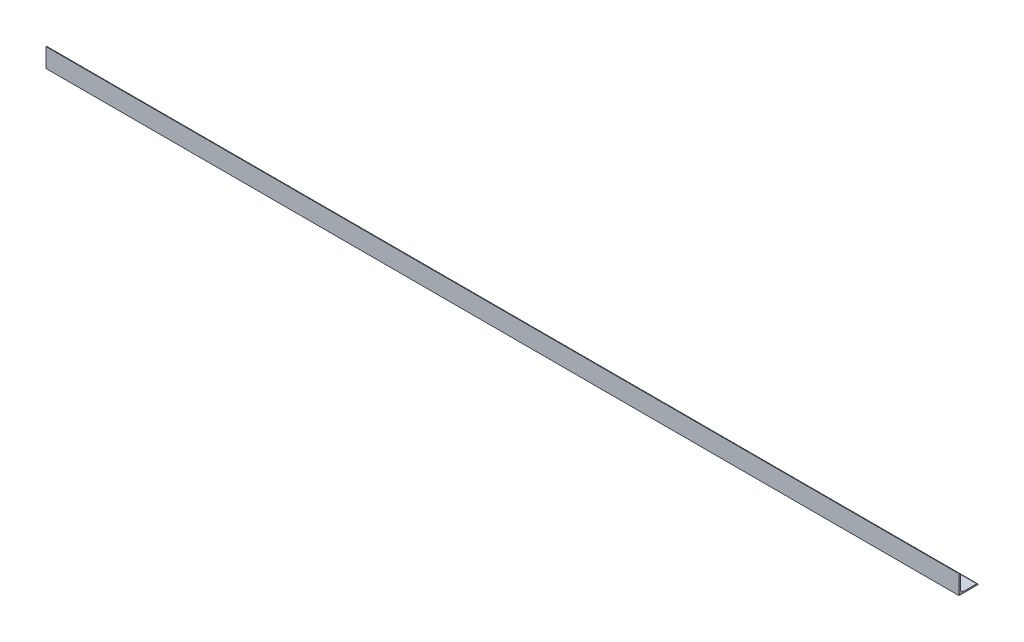
ISO-10303-21;
HEADER;
FILE_DESCRIPTION(('STEP AP214'),'2;1');
FILE_NAME('part.step','',(''),(''),'','','');
FILE_SCHEMA(('AUTOMOTIVE_DESIGN { 1 0 10303 214 1 1 1 1 }'));
ENDSEC;
DATA;
#1=APPLICATION_CONTEXT('core data for automotive mechanical design processes');
#2=APPLICATION_PROTOCOL_DEFINITION('international standard','automotive_design',2000,#1);
#3=PRODUCT_CONTEXT('',#1,'mechanical');
#4=PRODUCT('Part','Part','',(#3));
#5=PRODUCT_RELATED_PRODUCT_CATEGORY('part','',(#4));
#6=PRODUCT_DEFINITION_FORMATION('','',#4);
#7=PRODUCT_DEFINITION_CONTEXT('part definition',#1,'design');
#8=PRODUCT_DEFINITION('design','',#6,#7);
#9=PRODUCT_DEFINITION_SHAPE('','',#8);
#10=(LENGTH_UNIT() NAMED_UNIT(*) SI_UNIT(.MILLI.,.METRE.));
#11=(NAMED_UNIT(*) PLANE_ANGLE_UNIT() SI_UNIT($,.RADIAN.));
#12=(NAMED_UNIT(*) SI_UNIT($,.STERADIAN.) SOLID_ANGLE_UNIT());
#13=UNCERTAINTY_MEASURE_WITH_UNIT(LENGTH_MEASURE(1.E-05),#10,'distance_accuracy_value','');
#14=(GEOMETRIC_REPRESENTATION_CONTEXT(3) GLOBAL_UNCERTAINTY_ASSIGNED_CONTEXT((#13)) GLOBAL_UNIT_ASSIGNED_CONTEXT((#10,
#11,#12)) REPRESENTATION_CONTEXT('',''));
#15=CARTESIAN_POINT('',(0.,0.,0.));
#16=DIRECTION('',(0.,0.,1.));
#17=DIRECTION('',(1.,0.,0.));
#18=AXIS2_PLACEMENT_3D('',#15,#16,#17);
#19=CARTESIAN_POINT('',(1920.,0.,-40.));
#20=DIRECTION('',(0.,1.,0.));
#21=DIRECTION('',(0.,0.,1.));
#22=AXIS2_PLACEMENT_3D('',#19,#20,#21);
#23=PLANE('',#22);
#24=DIRECTION('',(0.,0.,-1.));
#25=VECTOR('',#24,1.);
#26=CARTESIAN_POINT('',(0.,0.,-40.));
#27=LINE('',#26,#25);
#28=CARTESIAN_POINT('',(0.,0.,0.));
#29=VERTEX_POINT('',#28);
#30=CARTESIAN_POINT('',(0.,0.,-40.));
#31=VERTEX_POINT('',#30);
#32=EDGE_CURVE('E150',#29,#31,#27,.T.);
#33=ORIENTED_EDGE('',*,*,#32,.T.);
#34=DIRECTION('',(-1.,0.,0.));
#35=VECTOR('',#34,1.);
#36=CARTESIAN_POINT('',(1920.,0.,-40.));
#37=LINE('',#36,#35);
#38=CARTESIAN_POINT('',(1920.,0.,-40.));
#39=VERTEX_POINT('',#38);
#40=EDGE_CURVE('E13',#39,#31,#37,.T.);
#41=ORIENTED_EDGE('',*,*,#40,.F.);
#42=DIRECTION('',(0.,0.,-1.));
#43=VECTOR('',#42,1.);
#44=CARTESIAN_POINT('',(1920.,0.,-40.));
#45=LINE('',#44,#43);
#46=CARTESIAN_POINT('',(1920.,0.,0.));
#47=VERTEX_POINT('',#46);
#48=EDGE_CURVE('E162',#47,#39,#45,.T.);
#49=ORIENTED_EDGE('',*,*,#48,.F.);
#50=DIRECTION('',(-1.,0.,0.));
#51=VECTOR('',#50,1.);
#52=CARTESIAN_POINT('',(1920.,0.,0.));
#53=LINE('',#52,#51);
#54=EDGE_CURVE('E146',#47,#29,#53,.T.);
#55=ORIENTED_EDGE('',*,*,#54,.T.);
#56=EDGE_LOOP('',(#33,#41,#49,#55));
#57=FACE_BOUND('',#56,.T.);
#58=ADVANCED_FACE('F60',(#57),#23,.F.);
#59=CARTESIAN_POINT('',(1920.,0.,-37.));
#60=DIRECTION('',(-1.,0.,0.));
#61=DIRECTION('',(0.,0.,1.));
#62=AXIS2_PLACEMENT_3D('',#59,#60,#61);
#63=CYLINDRICAL_SURFACE('',#62,3.);
#64=CARTESIAN_POINT('',(0.,0.,-37.));
#65=DIRECTION('',(1.,0.,0.));
#66=DIRECTION('',(0.,0.,-1.));
#67=AXIS2_PLACEMENT_3D('',#64,#65,#66);
#68=CIRCLE('',#67,3.);
#69=CARTESIAN_POINT('',(0.,3.,-37.));
#70=VERTEX_POINT('',#69);
#71=EDGE_CURVE('E153',#31,#70,#68,.T.);
#72=ORIENTED_EDGE('',*,*,#71,.T.);
#73=DIRECTION('',(-1.,0.,0.));
#74=VECTOR('',#73,1.);
#75=CARTESIAN_POINT('',(1920.,3.,-37.));
#76=LINE('',#75,#74);
#77=CARTESIAN_POINT('',(1920.,3.,-37.));
#78=VERTEX_POINT('',#77);
#79=EDGE_CURVE('E68',#78,#70,#76,.T.);
#80=ORIENTED_EDGE('',*,*,#79,.F.);
#81=CARTESIAN_POINT('',(1920.,0.,-37.));
#82=DIRECTION('',(1.,0.,0.));
#83=DIRECTION('',(0.,0.,-1.));
#84=AXIS2_PLACEMENT_3D('',#81,#82,#83);
#85=CIRCLE('',#84,3.);
#86=EDGE_CURVE('E116',#39,#78,#85,.T.);
#87=ORIENTED_EDGE('',*,*,#86,.F.);
#88=ORIENTED_EDGE('',*,*,#40,.T.);
#89=EDGE_LOOP('',(#72,#80,#87,#88));
#90=FACE_BOUND('',#89,.T.);
#91=ADVANCED_FACE('F187',(#90),#63,.T.);
#92=CARTESIAN_POINT('',(1920.,3.,-9.));
#93=DIRECTION('',(0.,-1.,0.));
#94=DIRECTION('',(0.,0.,-1.));
#95=AXIS2_PLACEMENT_3D('',#92,#93,#94);
#96=PLANE('',#95);
#97=DIRECTION('',(0.,0.,1.));
#98=VECTOR('',#97,1.);
#99=CARTESIAN_POINT('',(0.,3.,-9.));
#100=LINE('',#99,#98);
#101=CARTESIAN_POINT('',(0.,3.,-9.00000000000001));
#102=VERTEX_POINT('',#101);
#103=EDGE_CURVE('E155',#70,#102,#100,.T.);
#104=ORIENTED_EDGE('',*,*,#103,.T.);
#105=DIRECTION('',(-1.,0.,0.));
#106=VECTOR('',#105,1.);
#107=CARTESIAN_POINT('',(1920.,3.,-9.00000000000001));
#108=LINE('',#107,#106);
#109=CARTESIAN_POINT('',(1920.,3.,-9.00000000000001));
#110=VERTEX_POINT('',#109);
#111=EDGE_CURVE('E166',#110,#102,#108,.T.);
#112=ORIENTED_EDGE('',*,*,#111,.F.);
#113=DIRECTION('',(0.,0.,1.));
#114=VECTOR('',#113,1.);
#115=CARTESIAN_POINT('',(1920.,3.,-9.));
#116=LINE('',#115,#114);
#117=EDGE_CURVE('E174',#78,#110,#116,.T.);
#118=ORIENTED_EDGE('',*,*,#117,.F.);
#119=ORIENTED_EDGE('',*,*,#79,.T.);
#120=EDGE_LOOP('',(#104,#112,#118,#119));
#121=FACE_BOUND('',#120,.T.);
#122=ADVANCED_FACE('F172',(#121),#96,.F.);
#123=CARTESIAN_POINT('',(1920.,9.,-9.));
#124=DIRECTION('',(-1.,0.,0.));
#125=DIRECTION('',(0.,0.,1.));
#126=AXIS2_PLACEMENT_3D('',#123,#124,#125);
#127=CYLINDRICAL_SURFACE('',#126,6.);
#128=CARTESIAN_POINT('',(0.,9.,-9.));
#129=DIRECTION('',(-1.,0.,0.));
#130=DIRECTION('',(0.,0.,1.));
#131=AXIS2_PLACEMENT_3D('',#128,#129,#130);
#132=CIRCLE('',#131,6.);
#133=CARTESIAN_POINT('',(0.,9.,-3.));
#134=VERTEX_POINT('',#133);
#135=EDGE_CURVE('E157',#102,#134,#132,.T.);
#136=ORIENTED_EDGE('',*,*,#135,.T.);
#137=DIRECTION('',(-1.,0.,0.));
#138=VECTOR('',#137,1.);
#139=CARTESIAN_POINT('',(1920.,9.,-3.));
#140=LINE('',#139,#138);
#141=CARTESIAN_POINT('',(1920.,9.,-3.));
#142=VERTEX_POINT('',#141);
#143=EDGE_CURVE('E141',#142,#134,#140,.T.);
#144=ORIENTED_EDGE('',*,*,#143,.F.);
#145=CARTESIAN_POINT('',(1920.,9.,-9.));
#146=DIRECTION('',(-1.,0.,0.));
#147=DIRECTION('',(0.,0.,1.));
#148=AXIS2_PLACEMENT_3D('',#145,#146,#147);
#149=CIRCLE('',#148,6.);
#150=EDGE_CURVE('E132',#110,#142,#149,.T.);
#151=ORIENTED_EDGE('',*,*,#150,.F.);
#152=ORIENTED_EDGE('',*,*,#111,.T.);
#153=EDGE_LOOP('',(#136,#144,#151,#152));
#154=FACE_BOUND('',#153,.T.);
#155=ADVANCED_FACE('F180',(#154),#127,.F.);
#156=CARTESIAN_POINT('',(1920.,37.,-3.));
#157=DIRECTION('',(0.,0.,1.));
#158=DIRECTION('',(1.,0.,0.));
#159=AXIS2_PLACEMENT_3D('',#156,#157,#158);
#160=PLANE('',#159);
#161=DIRECTION('',(0.,1.,0.));
#162=VECTOR('',#161,1.);
#163=CARTESIAN_POINT('',(0.,37.,-3.));
#164=LINE('',#163,#162);
#165=CARTESIAN_POINT('',(0.,37.,-3.));
#166=VERTEX_POINT('',#165);
#167=EDGE_CURVE('E140',#134,#166,#164,.T.);
#168=ORIENTED_EDGE('',*,*,#167,.T.);
#169=DIRECTION('',(-1.,0.,0.));
#170=VECTOR('',#169,1.);
#171=CARTESIAN_POINT('',(1920.,37.,-3.));
#172=LINE('',#171,#170);
#173=CARTESIAN_POINT('',(1920.,37.,-3.));
#174=VERTEX_POINT('',#173);
#175=EDGE_CURVE('E137',#174,#166,#172,.T.);
#176=ORIENTED_EDGE('',*,*,#175,.F.);
#177=DIRECTION('',(0.,1.,0.));
#178=VECTOR('',#177,1.);
#179=CARTESIAN_POINT('',(1920.,37.,-3.));
#180=LINE('',#179,#178);
#181=EDGE_CURVE('E126',#142,#174,#180,.T.);
#182=ORIENTED_EDGE('',*,*,#181,.F.);
#183=ORIENTED_EDGE('',*,*,#143,.T.);
#184=EDGE_LOOP('',(#168,#176,#182,#183));
#185=FACE_BOUND('',#184,.T.);
#186=ADVANCED_FACE('F138',(#185),#160,.F.);
#187=CARTESIAN_POINT('',(1920.,37.,0.));
#188=DIRECTION('',(-1.,0.,0.));
#189=DIRECTION('',(0.,0.,1.));
#190=AXIS2_PLACEMENT_3D('',#187,#188,#189);
#191=CYLINDRICAL_SURFACE('',#190,3.);
#192=CARTESIAN_POINT('',(0.,37.,0.));
#193=DIRECTION('',(1.,0.,0.));
#194=DIRECTION('',(0.,0.,-1.));
#195=AXIS2_PLACEMENT_3D('',#192,#193,#194);
#196=CIRCLE('',#195,3.);
#197=CARTESIAN_POINT('',(0.,40.,0.));
#198=VERTEX_POINT('',#197);
#199=EDGE_CURVE('E102',#166,#198,#196,.T.);
#200=ORIENTED_EDGE('',*,*,#199,.T.);
#201=DIRECTION('',(-1.,0.,0.));
#202=VECTOR('',#201,1.);
#203=CARTESIAN_POINT('',(1920.,40.,0.));
#204=LINE('',#203,#202);
#205=CARTESIAN_POINT('',(1920.,40.,0.));
#206=VERTEX_POINT('',#205);
#207=EDGE_CURVE('E142',#206,#198,#204,.T.);
#208=ORIENTED_EDGE('',*,*,#207,.F.);
#209=CARTESIAN_POINT('',(1920.,37.,0.));
#210=DIRECTION('',(1.,0.,0.));
#211=DIRECTION('',(0.,0.,-1.));
#212=AXIS2_PLACEMENT_3D('',#209,#210,#211);
#213=CIRCLE('',#212,3.);
#214=EDGE_CURVE('E130',#174,#206,#213,.T.);
#215=ORIENTED_EDGE('',*,*,#214,.F.);
#216=ORIENTED_EDGE('',*,*,#175,.T.);
#217=EDGE_LOOP('',(#200,#208,#215,#216));
#218=FACE_BOUND('',#217,.T.);
#219=ADVANCED_FACE('F144',(#218),#191,.T.);
#220=CARTESIAN_POINT('',(1920.,40.,0.));
#221=DIRECTION('',(0.,0.,-1.));
#222=DIRECTION('',(-1.,0.,0.));
#223=AXIS2_PLACEMENT_3D('',#220,#221,#222);
#224=PLANE('',#223);
#225=DIRECTION('',(0.,-1.,0.));
#226=VECTOR('',#225,1.);
#227=CARTESIAN_POINT('',(0.,40.,0.));
#228=LINE('',#227,#226);
#229=EDGE_CURVE('E108',#198,#29,#228,.T.);
#230=ORIENTED_EDGE('',*,*,#229,.T.);
#231=ORIENTED_EDGE('',*,*,#54,.F.);
#232=DIRECTION('',(0.,-1.,0.));
#233=VECTOR('',#232,1.);
#234=CARTESIAN_POINT('',(1920.,40.,0.));
#235=LINE('',#234,#233);
#236=EDGE_CURVE('E76',#206,#47,#235,.T.);
#237=ORIENTED_EDGE('',*,*,#236,.F.);
#238=ORIENTED_EDGE('',*,*,#207,.T.);
#239=EDGE_LOOP('',(#230,#231,#237,#238));
#240=FACE_BOUND('',#239,.T.);
#241=ADVANCED_FACE('F201',(#240),#224,.F.);
#242=CARTESIAN_POINT('',(1920.,37.,0.));
#243=DIRECTION('',(1.,0.,0.));
#244=DIRECTION('',(0.,0.,-1.));
#245=AXIS2_PLACEMENT_3D('',#242,#243,#244);
#246=PLANE('',#245);
#247=ORIENTED_EDGE('',*,*,#48,.T.);
#248=ORIENTED_EDGE('',*,*,#86,.T.);
#249=ORIENTED_EDGE('',*,*,#117,.T.);
#250=ORIENTED_EDGE('',*,*,#150,.T.);
#251=ORIENTED_EDGE('',*,*,#181,.T.);
#252=ORIENTED_EDGE('',*,*,#214,.T.);
#253=ORIENTED_EDGE('',*,*,#236,.T.);
#254=EDGE_LOOP('',(#247,#248,#249,#250,#251,#252,#253));
#255=FACE_BOUND('',#254,.T.);
#256=ADVANCED_FACE('F128',(#255),#246,.T.);
#257=CARTESIAN_POINT('',(0.,37.,0.));
#258=DIRECTION('',(1.,0.,0.));
#259=DIRECTION('',(0.,0.,-1.));
#260=AXIS2_PLACEMENT_3D('',#257,#258,#259);
#261=PLANE('',#260);
#262=ORIENTED_EDGE('',*,*,#32,.F.);
#263=ORIENTED_EDGE('',*,*,#229,.F.);
#264=ORIENTED_EDGE('',*,*,#199,.F.);
#265=ORIENTED_EDGE('',*,*,#167,.F.);
#266=ORIENTED_EDGE('',*,*,#135,.F.);
#267=ORIENTED_EDGE('',*,*,#103,.F.);
#268=ORIENTED_EDGE('',*,*,#71,.F.);
#269=EDGE_LOOP('',(#262,#263,#264,#265,#266,#267,#268));
#270=FACE_BOUND('',#269,.T.);
#271=ADVANCED_FACE('F178',(#270),#261,.F.);
#272=CLOSED_SHELL('',(#58,#91,#122,#155,#186,#219,#241,#256,#271));
#273=MANIFOLD_SOLID_BREP('B2',#272);
#274=ADVANCED_BREP_SHAPE_REPRESENTATION('',(#18,#273),#14);
#275=SHAPE_DEFINITION_REPRESENTATION(#9,#274);
ENDSEC;
END-ISO-10303-21;
